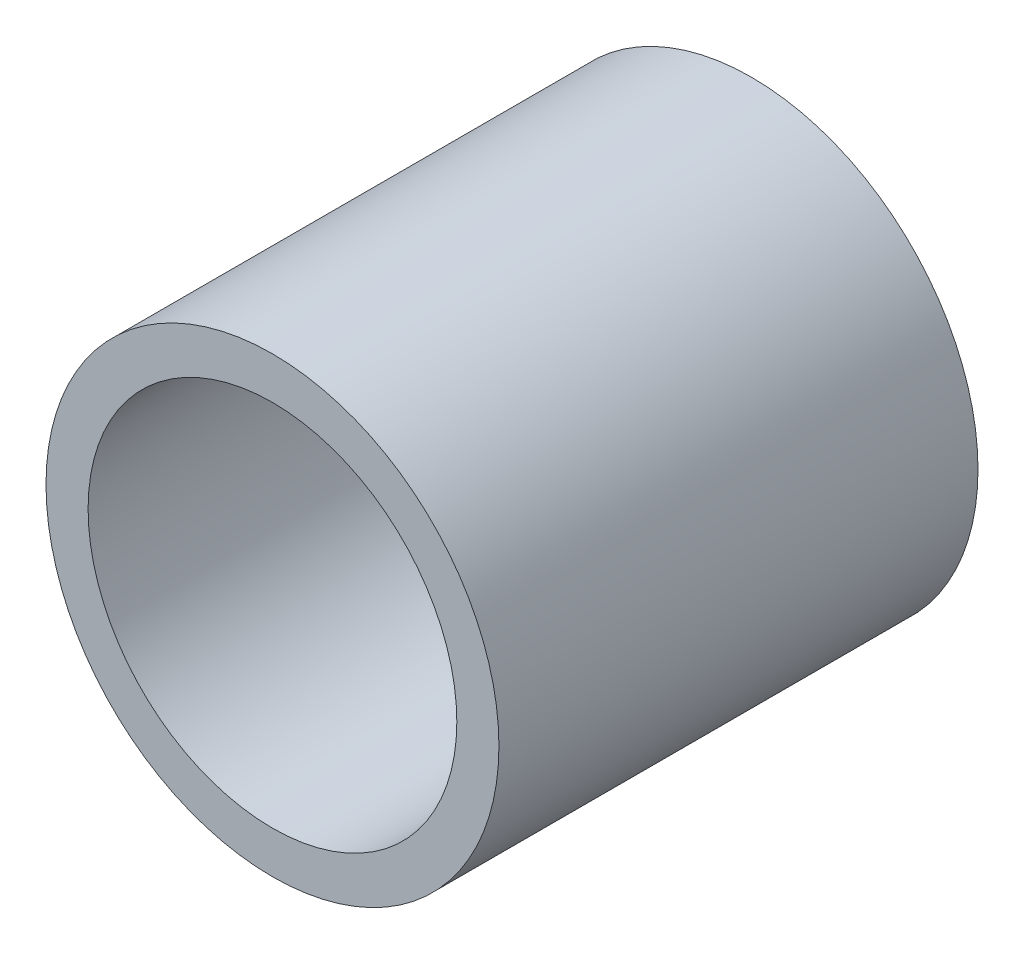
ISO-10303-21;
HEADER;
FILE_DESCRIPTION(('STEP AP214'),'2;1');
FILE_NAME('part.step','',(''),(''),'','','');
FILE_SCHEMA(('AUTOMOTIVE_DESIGN { 1 0 10303 214 1 1 1 1 }'));
ENDSEC;
DATA;
#1=APPLICATION_CONTEXT('core data for automotive mechanical design processes');
#2=APPLICATION_PROTOCOL_DEFINITION('international standard','automotive_design',2000,#1);
#3=PRODUCT_CONTEXT('',#1,'mechanical');
#4=PRODUCT('Part','Part','',(#3));
#5=PRODUCT_RELATED_PRODUCT_CATEGORY('part','',(#4));
#6=PRODUCT_DEFINITION_FORMATION('','',#4);
#7=PRODUCT_DEFINITION_CONTEXT('part definition',#1,'design');
#8=PRODUCT_DEFINITION('design','',#6,#7);
#9=PRODUCT_DEFINITION_SHAPE('','',#8);
#10=(LENGTH_UNIT() NAMED_UNIT(*) SI_UNIT(.MILLI.,.METRE.));
#11=(NAMED_UNIT(*) PLANE_ANGLE_UNIT() SI_UNIT($,.RADIAN.));
#12=(NAMED_UNIT(*) SI_UNIT($,.STERADIAN.) SOLID_ANGLE_UNIT());
#13=UNCERTAINTY_MEASURE_WITH_UNIT(LENGTH_MEASURE(1.E-05),#10,'distance_accuracy_value','');
#14=(GEOMETRIC_REPRESENTATION_CONTEXT(3) GLOBAL_UNCERTAINTY_ASSIGNED_CONTEXT((#13)) GLOBAL_UNIT_ASSIGNED_CONTEXT((#10,
#11,#12)) REPRESENTATION_CONTEXT('',''));
#15=CARTESIAN_POINT('',(0.,0.,0.));
#16=DIRECTION('',(0.,0.,1.));
#17=DIRECTION('',(1.,0.,0.));
#18=AXIS2_PLACEMENT_3D('',#15,#16,#17);
#19=CARTESIAN_POINT('',(0.,0.,3.));
#20=DIRECTION('',(0.,0.,1.));
#21=DIRECTION('',(1.,0.,0.));
#22=AXIS2_PLACEMENT_3D('',#19,#20,#21);
#23=PLANE('',#22);
#24=CARTESIAN_POINT('',(9.,0.,3.));
#25=DIRECTION('',(0.,0.,1.));
#26=DIRECTION('',(1.,0.,0.));
#27=AXIS2_PLACEMENT_3D('',#24,#25,#26);
#28=CIRCLE('',#27,1.65);
#29=CARTESIAN_POINT('',(10.65,0.,3.));
#30=VERTEX_POINT('',#29);
#31=EDGE_CURVE('E41',#30,#30,#28,.T.);
#32=ORIENTED_EDGE('',*,*,#31,.F.);
#33=EDGE_LOOP('',(#32));
#34=FACE_BOUND('',#33,.T.);
#35=CARTESIAN_POINT('',(-9.,0.,3.));
#36=DIRECTION('',(0.,0.,1.));
#37=DIRECTION('',(1.,0.,0.));
#38=AXIS2_PLACEMENT_3D('',#35,#36,#37);
#39=CIRCLE('',#38,1.65);
#40=CARTESIAN_POINT('',(-7.35,0.,3.));
#41=VERTEX_POINT('',#40);
#42=EDGE_CURVE('E45',#41,#41,#39,.T.);
#43=ORIENTED_EDGE('',*,*,#42,.F.);
#44=EDGE_LOOP('',(#43));
#45=FACE_BOUND('',#44,.T.);
#46=CARTESIAN_POINT('',(0.,0.,3.));
#47=DIRECTION('',(0.,0.,1.));
#48=DIRECTION('',(1.,0.,0.));
#49=AXIS2_PLACEMENT_3D('',#46,#47,#48);
#50=CIRCLE('',#49,6.3);
#51=CARTESIAN_POINT('',(6.3,0.,3.));
#52=VERTEX_POINT('',#51);
#53=EDGE_CURVE('E50',#52,#52,#50,.T.);
#54=ORIENTED_EDGE('',*,*,#53,.F.);
#55=EDGE_LOOP('',(#54));
#56=FACE_BOUND('',#55,.T.);
#57=CARTESIAN_POINT('',(0.,0.,3.));
#58=DIRECTION('',(0.,0.,1.));
#59=DIRECTION('',(1.,0.,0.));
#60=AXIS2_PLACEMENT_3D('',#57,#58,#59);
#61=CIRCLE('',#60,12.7);
#62=CARTESIAN_POINT('',(12.7,0.,3.));
#63=VERTEX_POINT('',#62);
#64=EDGE_CURVE('E10',#63,#63,#61,.F.);
#65=ORIENTED_EDGE('',*,*,#64,.F.);
#66=EDGE_LOOP('',(#65));
#67=FACE_BOUND('',#66,.T.);
#68=ADVANCED_FACE('F34',(#34,#45,#56,#67),#23,.T.);
#69=CARTESIAN_POINT('',(-9.,0.,3.));
#70=DIRECTION('',(0.,0.,-1.));
#71=DIRECTION('',(-1.,0.,0.));
#72=AXIS2_PLACEMENT_3D('',#69,#70,#71);
#73=CYLINDRICAL_SURFACE('',#72,1.65);
#74=ORIENTED_EDGE('',*,*,#42,.T.);
#75=EDGE_LOOP('',(#74));
#76=FACE_BOUND('',#75,.T.);
#77=CARTESIAN_POINT('',(-9.,0.,0.));
#78=DIRECTION('',(0.,0.,1.));
#79=DIRECTION('',(1.,0.,0.));
#80=AXIS2_PLACEMENT_3D('',#77,#78,#79);
#81=CIRCLE('',#80,1.65);
#82=CARTESIAN_POINT('',(-7.35,0.,0.));
#83=VERTEX_POINT('',#82);
#84=EDGE_CURVE('E61',#83,#83,#81,.T.);
#85=ORIENTED_EDGE('',*,*,#84,.F.);
#86=EDGE_LOOP('',(#85));
#87=FACE_BOUND('',#86,.T.);
#88=ADVANCED_FACE('F94',(#76,#87),#73,.F.);
#89=CARTESIAN_POINT('',(0.,0.,3.));
#90=DIRECTION('',(0.,0.,-1.));
#91=DIRECTION('',(-1.,0.,0.));
#92=AXIS2_PLACEMENT_3D('',#89,#90,#91);
#93=CYLINDRICAL_SURFACE('',#92,6.3);
#94=ORIENTED_EDGE('',*,*,#53,.T.);
#95=EDGE_LOOP('',(#94));
#96=FACE_BOUND('',#95,.T.);
#97=CARTESIAN_POINT('',(0.,0.,0.));
#98=DIRECTION('',(0.,0.,1.));
#99=DIRECTION('',(1.,0.,0.));
#100=AXIS2_PLACEMENT_3D('',#97,#98,#99);
#101=CIRCLE('',#100,6.3);
#102=CARTESIAN_POINT('',(6.3,0.,0.));
#103=VERTEX_POINT('',#102);
#104=EDGE_CURVE('E57',#103,#103,#101,.T.);
#105=ORIENTED_EDGE('',*,*,#104,.F.);
#106=EDGE_LOOP('',(#105));
#107=FACE_BOUND('',#106,.T.);
#108=ADVANCED_FACE('F99',(#96,#107),#93,.F.);
#109=CARTESIAN_POINT('',(0.,0.,3.));
#110=DIRECTION('',(0.,0.,-1.));
#111=DIRECTION('',(-1.,0.,0.));
#112=AXIS2_PLACEMENT_3D('',#109,#110,#111);
#113=CYLINDRICAL_SURFACE('',#112,15.6);
#114=CARTESIAN_POINT('',(0.,0.,0.));
#115=DIRECTION('',(0.,0.,1.));
#116=DIRECTION('',(1.,0.,0.));
#117=AXIS2_PLACEMENT_3D('',#114,#115,#116);
#118=CIRCLE('',#117,15.6);
#119=CARTESIAN_POINT('',(15.6,0.,0.));
#120=VERTEX_POINT('',#119);
#121=EDGE_CURVE('E54',#120,#120,#118,.T.);
#122=ORIENTED_EDGE('',*,*,#121,.T.);
#123=EDGE_LOOP('',(#122));
#124=FACE_BOUND('',#123,.T.);
#125=CARTESIAN_POINT('',(0.,0.,33.));
#126=DIRECTION('',(0.,0.,1.));
#127=DIRECTION('',(1.,0.,0.));
#128=AXIS2_PLACEMENT_3D('',#125,#126,#127);
#129=CIRCLE('',#128,15.6);
#130=CARTESIAN_POINT('',(15.6,0.,33.));
#131=VERTEX_POINT('',#130);
#132=EDGE_CURVE('E58',#131,#131,#129,.T.);
#133=ORIENTED_EDGE('',*,*,#132,.F.);
#134=EDGE_LOOP('',(#133));
#135=FACE_BOUND('',#134,.T.);
#136=ADVANCED_FACE('F36',(#124,#135),#113,.T.);
#137=CARTESIAN_POINT('',(9.,0.,3.));
#138=DIRECTION('',(0.,0.,-1.));
#139=DIRECTION('',(-1.,0.,0.));
#140=AXIS2_PLACEMENT_3D('',#137,#138,#139);
#141=CYLINDRICAL_SURFACE('',#140,1.65);
#142=ORIENTED_EDGE('',*,*,#31,.T.);
#143=EDGE_LOOP('',(#142));
#144=FACE_BOUND('',#143,.T.);
#145=CARTESIAN_POINT('',(9.,0.,0.));
#146=DIRECTION('',(0.,0.,1.));
#147=DIRECTION('',(1.,0.,0.));
#148=AXIS2_PLACEMENT_3D('',#145,#146,#147);
#149=CIRCLE('',#148,1.65);
#150=CARTESIAN_POINT('',(10.65,0.,0.));
#151=VERTEX_POINT('',#150);
#152=EDGE_CURVE('E63',#151,#151,#149,.T.);
#153=ORIENTED_EDGE('',*,*,#152,.F.);
#154=EDGE_LOOP('',(#153));
#155=FACE_BOUND('',#154,.T.);
#156=ADVANCED_FACE('F89',(#144,#155),#141,.F.);
#157=CARTESIAN_POINT('',(0.,0.,0.));
#158=DIRECTION('',(0.,0.,1.));
#159=DIRECTION('',(1.,0.,0.));
#160=AXIS2_PLACEMENT_3D('',#157,#158,#159);
#161=PLANE('',#160);
#162=ORIENTED_EDGE('',*,*,#121,.F.);
#163=EDGE_LOOP('',(#162));
#164=FACE_BOUND('',#163,.T.);
#165=ORIENTED_EDGE('',*,*,#104,.T.);
#166=EDGE_LOOP('',(#165));
#167=FACE_BOUND('',#166,.T.);
#168=ORIENTED_EDGE('',*,*,#84,.T.);
#169=EDGE_LOOP('',(#168));
#170=FACE_BOUND('',#169,.T.);
#171=ORIENTED_EDGE('',*,*,#152,.T.);
#172=EDGE_LOOP('',(#171));
#173=FACE_BOUND('',#172,.T.);
#174=ADVANCED_FACE('F81',(#164,#167,#170,#173),#161,.F.);
#175=CARTESIAN_POINT('',(0.,0.,33.));
#176=DIRECTION('',(0.,0.,1.));
#177=DIRECTION('',(1.,0.,0.));
#178=AXIS2_PLACEMENT_3D('',#175,#176,#177);
#179=PLANE('',#178);
#180=ORIENTED_EDGE('',*,*,#132,.T.);
#181=EDGE_LOOP('',(#180));
#182=FACE_BOUND('',#181,.T.);
#183=CARTESIAN_POINT('',(0.,0.,33.));
#184=DIRECTION('',(0.,0.,1.));
#185=DIRECTION('',(1.,0.,0.));
#186=AXIS2_PLACEMENT_3D('',#183,#184,#185);
#187=CIRCLE('',#186,12.7);
#188=CARTESIAN_POINT('',(12.7,0.,33.));
#189=VERTEX_POINT('',#188);
#190=EDGE_CURVE('E73',#189,#189,#187,.T.);
#191=ORIENTED_EDGE('',*,*,#190,.F.);
#192=EDGE_LOOP('',(#191));
#193=FACE_BOUND('',#192,.T.);
#194=ADVANCED_FACE('F79',(#182,#193),#179,.T.);
#195=CARTESIAN_POINT('',(0.,0.,33.));
#196=DIRECTION('',(0.,0.,-1.));
#197=DIRECTION('',(-1.,0.,0.));
#198=AXIS2_PLACEMENT_3D('',#195,#196,#197);
#199=CYLINDRICAL_SURFACE('',#198,12.7);
#200=ORIENTED_EDGE('',*,*,#190,.T.);
#201=EDGE_LOOP('',(#200));
#202=FACE_BOUND('',#201,.T.);
#203=ORIENTED_EDGE('',*,*,#64,.T.);
#204=EDGE_LOOP('',(#203));
#205=FACE_BOUND('',#204,.T.);
#206=ADVANCED_FACE('F77',(#202,#205),#199,.F.);
#207=CLOSED_SHELL('',(#68,#88,#108,#136,#156,#174,#194,#206));
#208=MANIFOLD_SOLID_BREP('B2',#207);
#209=ADVANCED_BREP_SHAPE_REPRESENTATION('',(#18,#208),#14);
#210=SHAPE_DEFINITION_REPRESENTATION(#9,#209);
ENDSEC;
END-ISO-10303-21;
